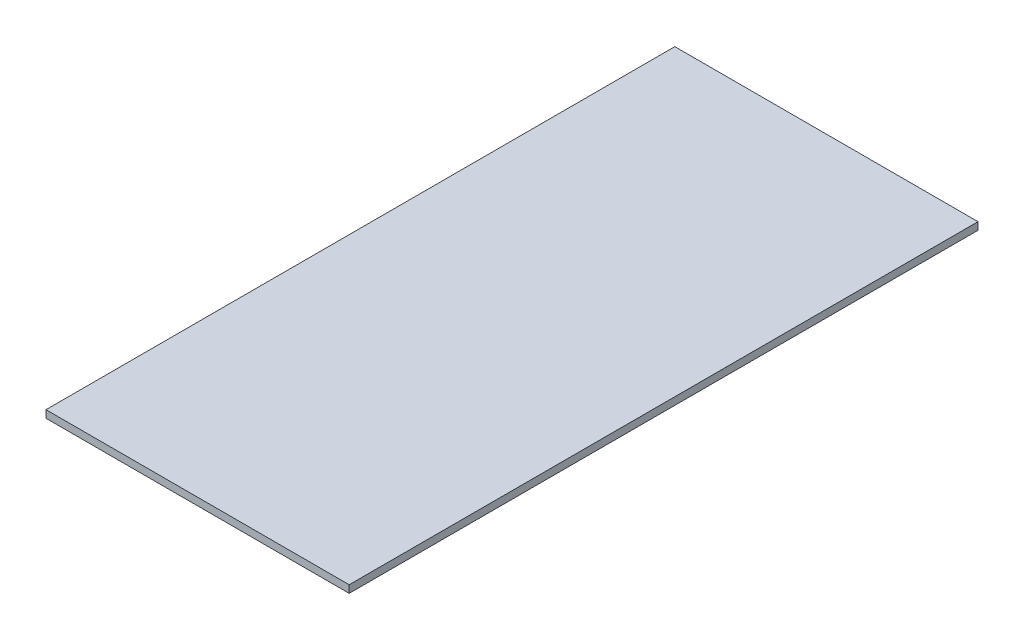
ISO-10303-21;
HEADER;
FILE_DESCRIPTION(('STEP AP214'),'2;1');
FILE_NAME('part.step','',(''),(''),'','','');
FILE_SCHEMA(('AUTOMOTIVE_DESIGN { 1 0 10303 214 1 1 1 1 }'));
ENDSEC;
DATA;
#1=APPLICATION_CONTEXT('core data for automotive mechanical design processes');
#2=APPLICATION_PROTOCOL_DEFINITION('international standard','automotive_design',2000,#1);
#3=PRODUCT_CONTEXT('',#1,'mechanical');
#4=PRODUCT('Part','Part','',(#3));
#5=PRODUCT_RELATED_PRODUCT_CATEGORY('part','',(#4));
#6=PRODUCT_DEFINITION_FORMATION('','',#4);
#7=PRODUCT_DEFINITION_CONTEXT('part definition',#1,'design');
#8=PRODUCT_DEFINITION('design','',#6,#7);
#9=PRODUCT_DEFINITION_SHAPE('','',#8);
#10=(LENGTH_UNIT() NAMED_UNIT(*) SI_UNIT(.MILLI.,.METRE.));
#11=(NAMED_UNIT(*) PLANE_ANGLE_UNIT() SI_UNIT($,.RADIAN.));
#12=(NAMED_UNIT(*) SI_UNIT($,.STERADIAN.) SOLID_ANGLE_UNIT());
#13=UNCERTAINTY_MEASURE_WITH_UNIT(LENGTH_MEASURE(1.E-05),#10,'distance_accuracy_value','');
#14=(GEOMETRIC_REPRESENTATION_CONTEXT(3) GLOBAL_UNCERTAINTY_ASSIGNED_CONTEXT((#13)) GLOBAL_UNIT_ASSIGNED_CONTEXT((#10,
#11,#12)) REPRESENTATION_CONTEXT('',''));
#15=CARTESIAN_POINT('',(0.,0.,0.));
#16=DIRECTION('',(0.,0.,1.));
#17=DIRECTION('',(1.,0.,0.));
#18=AXIS2_PLACEMENT_3D('',#15,#16,#17);
#19=CARTESIAN_POINT('',(257.175,12.7,533.4));
#20=DIRECTION('',(-1.,0.,0.));
#21=DIRECTION('',(0.,0.,1.));
#22=AXIS2_PLACEMENT_3D('',#19,#20,#21);
#23=PLANE('',#22);
#24=DIRECTION('',(0.,0.,-1.));
#25=VECTOR('',#24,1.);
#26=CARTESIAN_POINT('',(257.175,0.,533.4));
#27=LINE('',#26,#25);
#28=CARTESIAN_POINT('',(257.175,0.,533.4));
#29=VERTEX_POINT('',#28);
#30=CARTESIAN_POINT('',(257.175,0.,-533.4));
#31=VERTEX_POINT('',#30);
#32=EDGE_CURVE('E99',#29,#31,#27,.T.);
#33=ORIENTED_EDGE('',*,*,#32,.T.);
#34=DIRECTION('',(0.,-1.,0.));
#35=VECTOR('',#34,1.);
#36=CARTESIAN_POINT('',(257.175,12.7,-533.4));
#37=LINE('',#36,#35);
#38=CARTESIAN_POINT('',(257.175,12.7,-533.4));
#39=VERTEX_POINT('',#38);
#40=EDGE_CURVE('E11',#39,#31,#37,.T.);
#41=ORIENTED_EDGE('',*,*,#40,.F.);
#42=DIRECTION('',(0.,0.,-1.));
#43=VECTOR('',#42,1.);
#44=CARTESIAN_POINT('',(257.175,12.7,533.4));
#45=LINE('',#44,#43);
#46=CARTESIAN_POINT('',(257.175,12.7,533.4));
#47=VERTEX_POINT('',#46);
#48=EDGE_CURVE('E87',#47,#39,#45,.T.);
#49=ORIENTED_EDGE('',*,*,#48,.F.);
#50=DIRECTION('',(0.,-1.,0.));
#51=VECTOR('',#50,1.);
#52=CARTESIAN_POINT('',(257.175,12.7,533.4));
#53=LINE('',#52,#51);
#54=EDGE_CURVE('E95',#47,#29,#53,.T.);
#55=ORIENTED_EDGE('',*,*,#54,.T.);
#56=EDGE_LOOP('',(#33,#41,#49,#55));
#57=FACE_BOUND('',#56,.T.);
#58=ADVANCED_FACE('F36',(#57),#23,.F.);
#59=CARTESIAN_POINT('',(-257.175,12.7,-533.4));
#60=DIRECTION('',(0.,0.,1.));
#61=DIRECTION('',(1.,0.,0.));
#62=AXIS2_PLACEMENT_3D('',#59,#60,#61);
#63=PLANE('',#62);
#64=DIRECTION('',(-1.,0.,0.));
#65=VECTOR('',#64,1.);
#66=CARTESIAN_POINT('',(-257.175,0.,-533.4));
#67=LINE('',#66,#65);
#68=CARTESIAN_POINT('',(-257.175,0.,-533.4));
#69=VERTEX_POINT('',#68);
#70=EDGE_CURVE('E91',#31,#69,#67,.T.);
#71=ORIENTED_EDGE('',*,*,#70,.T.);
#72=DIRECTION('',(0.,-1.,0.));
#73=VECTOR('',#72,1.);
#74=CARTESIAN_POINT('',(-257.175,12.7,-533.4));
#75=LINE('',#74,#73);
#76=CARTESIAN_POINT('',(-257.175,12.7,-533.4));
#77=VERTEX_POINT('',#76);
#78=EDGE_CURVE('E44',#77,#69,#75,.T.);
#79=ORIENTED_EDGE('',*,*,#78,.F.);
#80=DIRECTION('',(-1.,0.,0.));
#81=VECTOR('',#80,1.);
#82=CARTESIAN_POINT('',(-257.175,12.7,-533.4));
#83=LINE('',#82,#81);
#84=EDGE_CURVE('E82',#39,#77,#83,.T.);
#85=ORIENTED_EDGE('',*,*,#84,.F.);
#86=ORIENTED_EDGE('',*,*,#40,.T.);
#87=EDGE_LOOP('',(#71,#79,#85,#86));
#88=FACE_BOUND('',#87,.T.);
#89=ADVANCED_FACE('F90',(#88),#63,.F.);
#90=CARTESIAN_POINT('',(-257.175,12.7,533.4));
#91=DIRECTION('',(1.,0.,0.));
#92=DIRECTION('',(0.,0.,-1.));
#93=AXIS2_PLACEMENT_3D('',#90,#91,#92);
#94=PLANE('',#93);
#95=DIRECTION('',(0.,0.,1.));
#96=VECTOR('',#95,1.);
#97=CARTESIAN_POINT('',(-257.175,0.,533.4));
#98=LINE('',#97,#96);
#99=CARTESIAN_POINT('',(-257.175,0.,533.4));
#100=VERTEX_POINT('',#99);
#101=EDGE_CURVE('E69',#69,#100,#98,.T.);
#102=ORIENTED_EDGE('',*,*,#101,.T.);
#103=DIRECTION('',(0.,-1.,0.));
#104=VECTOR('',#103,1.);
#105=CARTESIAN_POINT('',(-257.175,12.7,533.4));
#106=LINE('',#105,#104);
#107=CARTESIAN_POINT('',(-257.175,12.7,533.4));
#108=VERTEX_POINT('',#107);
#109=EDGE_CURVE('E92',#108,#100,#106,.T.);
#110=ORIENTED_EDGE('',*,*,#109,.F.);
#111=DIRECTION('',(0.,0.,1.));
#112=VECTOR('',#111,1.);
#113=CARTESIAN_POINT('',(-257.175,12.7,533.4));
#114=LINE('',#113,#112);
#115=EDGE_CURVE('E85',#77,#108,#114,.T.);
#116=ORIENTED_EDGE('',*,*,#115,.F.);
#117=ORIENTED_EDGE('',*,*,#78,.T.);
#118=EDGE_LOOP('',(#102,#110,#116,#117));
#119=FACE_BOUND('',#118,.T.);
#120=ADVANCED_FACE('F93',(#119),#94,.F.);
#121=CARTESIAN_POINT('',(-257.175,12.7,533.4));
#122=DIRECTION('',(0.,0.,-1.));
#123=DIRECTION('',(-1.,0.,0.));
#124=AXIS2_PLACEMENT_3D('',#121,#122,#123);
#125=PLANE('',#124);
#126=DIRECTION('',(1.,0.,0.));
#127=VECTOR('',#126,1.);
#128=CARTESIAN_POINT('',(-257.175,0.,533.4));
#129=LINE('',#128,#127);
#130=EDGE_CURVE('E75',#100,#29,#129,.T.);
#131=ORIENTED_EDGE('',*,*,#130,.T.);
#132=ORIENTED_EDGE('',*,*,#54,.F.);
#133=DIRECTION('',(1.,0.,0.));
#134=VECTOR('',#133,1.);
#135=CARTESIAN_POINT('',(-257.175,12.7,533.4));
#136=LINE('',#135,#134);
#137=EDGE_CURVE('E52',#108,#47,#136,.T.);
#138=ORIENTED_EDGE('',*,*,#137,.F.);
#139=ORIENTED_EDGE('',*,*,#109,.T.);
#140=EDGE_LOOP('',(#131,#132,#138,#139));
#141=FACE_BOUND('',#140,.T.);
#142=ADVANCED_FACE('F106',(#141),#125,.F.);
#143=CARTESIAN_POINT('',(0.,12.7,0.));
#144=DIRECTION('',(0.,-1.,0.));
#145=DIRECTION('',(0.,0.,-1.));
#146=AXIS2_PLACEMENT_3D('',#143,#144,#145);
#147=PLANE('',#146);
#148=ORIENTED_EDGE('',*,*,#48,.T.);
#149=ORIENTED_EDGE('',*,*,#84,.T.);
#150=ORIENTED_EDGE('',*,*,#115,.T.);
#151=ORIENTED_EDGE('',*,*,#137,.T.);
#152=EDGE_LOOP('',(#148,#149,#150,#151));
#153=FACE_BOUND('',#152,.T.);
#154=ADVANCED_FACE('F83',(#153),#147,.F.);
#155=CARTESIAN_POINT('',(0.,0.,0.));
#156=DIRECTION('',(0.,-1.,0.));
#157=DIRECTION('',(0.,0.,-1.));
#158=AXIS2_PLACEMENT_3D('',#155,#156,#157);
#159=PLANE('',#158);
#160=ORIENTED_EDGE('',*,*,#32,.F.);
#161=ORIENTED_EDGE('',*,*,#130,.F.);
#162=ORIENTED_EDGE('',*,*,#101,.F.);
#163=ORIENTED_EDGE('',*,*,#70,.F.);
#164=EDGE_LOOP('',(#160,#161,#162,#163));
#165=FACE_BOUND('',#164,.T.);
#166=ADVANCED_FACE('F109',(#165),#159,.T.);
#167=CLOSED_SHELL('',(#58,#89,#120,#142,#154,#166));
#168=MANIFOLD_SOLID_BREP('B2',#167);
#169=ADVANCED_BREP_SHAPE_REPRESENTATION('',(#18,#168),#14);
#170=SHAPE_DEFINITION_REPRESENTATION(#9,#169);
ENDSEC;
END-ISO-10303-21;
